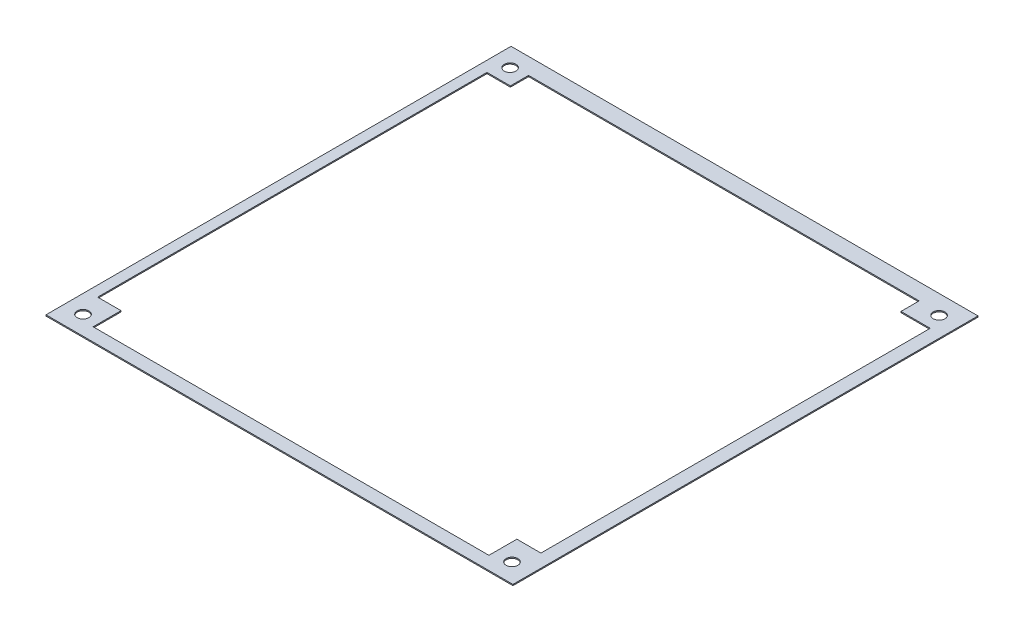
ISO-10303-21;
HEADER;
FILE_DESCRIPTION(('STEP AP214'),'2;1');
FILE_NAME('part.step','',(''),(''),'','','');
FILE_SCHEMA(('AUTOMOTIVE_DESIGN { 1 0 10303 214 1 1 1 1 }'));
ENDSEC;
DATA;
#1=APPLICATION_CONTEXT('core data for automotive mechanical design processes');
#2=APPLICATION_PROTOCOL_DEFINITION('international standard','automotive_design',2000,#1);
#3=PRODUCT_CONTEXT('',#1,'mechanical');
#4=PRODUCT('Part','Part','',(#3));
#5=PRODUCT_RELATED_PRODUCT_CATEGORY('part','',(#4));
#6=PRODUCT_DEFINITION_FORMATION('','',#4);
#7=PRODUCT_DEFINITION_CONTEXT('part definition',#1,'design');
#8=PRODUCT_DEFINITION('design','',#6,#7);
#9=PRODUCT_DEFINITION_SHAPE('','',#8);
#10=(LENGTH_UNIT() NAMED_UNIT(*) SI_UNIT(.MILLI.,.METRE.));
#11=(NAMED_UNIT(*) PLANE_ANGLE_UNIT() SI_UNIT($,.RADIAN.));
#12=(NAMED_UNIT(*) SI_UNIT($,.STERADIAN.) SOLID_ANGLE_UNIT());
#13=UNCERTAINTY_MEASURE_WITH_UNIT(LENGTH_MEASURE(1.E-05),#10,'distance_accuracy_value','');
#14=(GEOMETRIC_REPRESENTATION_CONTEXT(3) GLOBAL_UNCERTAINTY_ASSIGNED_CONTEXT((#13)) GLOBAL_UNIT_ASSIGNED_CONTEXT((#10,
#11,#12)) REPRESENTATION_CONTEXT('',''));
#15=CARTESIAN_POINT('',(0.,0.,0.));
#16=DIRECTION('',(0.,0.,1.));
#17=DIRECTION('',(1.,0.,0.));
#18=AXIS2_PLACEMENT_3D('',#15,#16,#17);
#19=CARTESIAN_POINT('',(-36.,-15.4,0.));
#20=DIRECTION('',(1.,0.,0.));
#21=DIRECTION('',(0.,0.,-1.));
#22=AXIS2_PLACEMENT_3D('',#19,#20,#21);
#23=PLANE('',#22);
#24=DIRECTION('',(0.,1.,0.));
#25=VECTOR('',#24,1.);
#26=CARTESIAN_POINT('',(-36.,-15.4,109.6));
#27=LINE('',#26,#25);
#28=CARTESIAN_POINT('',(-36.,-15.4,109.6));
#29=VERTEX_POINT('',#28);
#30=CARTESIAN_POINT('',(-36.,-14.8,109.6));
#31=VERTEX_POINT('',#30);
#32=EDGE_CURVE('E354',#29,#31,#27,.T.);
#33=ORIENTED_EDGE('',*,*,#32,.T.);
#34=DIRECTION('',(0.,0.,1.));
#35=VECTOR('',#34,1.);
#36=CARTESIAN_POINT('',(-36.,-14.8,-135.4));
#37=LINE('',#36,#35);
#38=CARTESIAN_POINT('',(-36.,-14.8,-135.4));
#39=VERTEX_POINT('',#38);
#40=EDGE_CURVE('E302',#39,#31,#37,.T.);
#41=ORIENTED_EDGE('',*,*,#40,.F.);
#42=DIRECTION('',(0.,1.,0.));
#43=VECTOR('',#42,1.);
#44=CARTESIAN_POINT('',(-36.,-15.4,-135.4));
#45=LINE('',#44,#43);
#46=CARTESIAN_POINT('',(-36.,-15.4,-135.4));
#47=VERTEX_POINT('',#46);
#48=EDGE_CURVE('E11',#47,#39,#45,.T.);
#49=ORIENTED_EDGE('',*,*,#48,.F.);
#50=DIRECTION('',(0.,0.,-1.));
#51=VECTOR('',#50,1.);
#52=CARTESIAN_POINT('',(-36.,-15.4,0.));
#53=LINE('',#52,#51);
#54=EDGE_CURVE('E339',#29,#47,#53,.T.);
#55=ORIENTED_EDGE('',*,*,#54,.F.);
#56=EDGE_LOOP('',(#33,#41,#49,#55));
#57=FACE_BOUND('',#56,.T.);
#58=ADVANCED_FACE('F47',(#57),#23,.F.);
#59=CARTESIAN_POINT('',(0.,-15.4,-135.4));
#60=DIRECTION('',(0.,0.,1.));
#61=DIRECTION('',(1.,0.,0.));
#62=AXIS2_PLACEMENT_3D('',#59,#60,#61);
#63=PLANE('',#62);
#64=ORIENTED_EDGE('',*,*,#48,.T.);
#65=DIRECTION('',(1.,0.,0.));
#66=VECTOR('',#65,1.);
#67=CARTESIAN_POINT('',(-36.,-14.8,-135.4));
#68=LINE('',#67,#66);
#69=CARTESIAN_POINT('',(210.,-14.8,-135.4));
#70=VERTEX_POINT('',#69);
#71=EDGE_CURVE('E298',#39,#70,#68,.T.);
#72=ORIENTED_EDGE('',*,*,#71,.T.);
#73=DIRECTION('',(0.,1.,0.));
#74=VECTOR('',#73,1.);
#75=CARTESIAN_POINT('',(210.,-15.4,-135.4));
#76=LINE('',#75,#74);
#77=CARTESIAN_POINT('',(210.,-15.4,-135.4));
#78=VERTEX_POINT('',#77);
#79=EDGE_CURVE('E56',#78,#70,#76,.T.);
#80=ORIENTED_EDGE('',*,*,#79,.F.);
#81=DIRECTION('',(1.,0.,0.));
#82=VECTOR('',#81,1.);
#83=CARTESIAN_POINT('',(0.,-15.4,-135.4));
#84=LINE('',#83,#82);
#85=EDGE_CURVE('E343',#47,#78,#84,.T.);
#86=ORIENTED_EDGE('',*,*,#85,.F.);
#87=EDGE_LOOP('',(#64,#72,#80,#86));
#88=FACE_BOUND('',#87,.T.);
#89=ADVANCED_FACE('F369',(#88),#63,.F.);
#90=CARTESIAN_POINT('',(210.,-15.4,0.));
#91=DIRECTION('',(1.,0.,0.));
#92=DIRECTION('',(0.,0.,-1.));
#93=AXIS2_PLACEMENT_3D('',#90,#91,#92);
#94=PLANE('',#93);
#95=DIRECTION('',(0.,0.,1.));
#96=VECTOR('',#95,1.);
#97=CARTESIAN_POINT('',(210.,-14.8,-135.4));
#98=LINE('',#97,#96);
#99=CARTESIAN_POINT('',(210.,-14.8,109.6));
#100=VERTEX_POINT('',#99);
#101=EDGE_CURVE('E305',#70,#100,#98,.T.);
#102=ORIENTED_EDGE('',*,*,#101,.T.);
#103=DIRECTION('',(0.,1.,0.));
#104=VECTOR('',#103,1.);
#105=CARTESIAN_POINT('',(210.,-15.4,109.6));
#106=LINE('',#105,#104);
#107=CARTESIAN_POINT('',(210.,-15.4,109.6));
#108=VERTEX_POINT('',#107);
#109=EDGE_CURVE('E358',#108,#100,#106,.T.);
#110=ORIENTED_EDGE('',*,*,#109,.F.);
#111=DIRECTION('',(0.,0.,-1.));
#112=VECTOR('',#111,1.);
#113=CARTESIAN_POINT('',(210.,-15.4,0.));
#114=LINE('',#113,#112);
#115=EDGE_CURVE('E346',#108,#78,#114,.T.);
#116=ORIENTED_EDGE('',*,*,#115,.T.);
#117=ORIENTED_EDGE('',*,*,#79,.T.);
#118=EDGE_LOOP('',(#102,#110,#116,#117));
#119=FACE_BOUND('',#118,.T.);
#120=ADVANCED_FACE('F366',(#119),#94,.T.);
#121=CARTESIAN_POINT('',(0.,-15.4,109.6));
#122=DIRECTION('',(0.,0.,1.));
#123=DIRECTION('',(1.,0.,0.));
#124=AXIS2_PLACEMENT_3D('',#121,#122,#123);
#125=PLANE('',#124);
#126=DIRECTION('',(1.,0.,0.));
#127=VECTOR('',#126,1.);
#128=CARTESIAN_POINT('',(-36.,-14.8,109.6));
#129=LINE('',#128,#127);
#130=EDGE_CURVE('E268',#31,#100,#129,.T.);
#131=ORIENTED_EDGE('',*,*,#130,.F.);
#132=ORIENTED_EDGE('',*,*,#32,.F.);
#133=DIRECTION('',(1.,0.,0.));
#134=VECTOR('',#133,1.);
#135=CARTESIAN_POINT('',(0.,-15.4,109.6));
#136=LINE('',#135,#134);
#137=EDGE_CURVE('E350',#29,#108,#136,.T.);
#138=ORIENTED_EDGE('',*,*,#137,.T.);
#139=ORIENTED_EDGE('',*,*,#109,.T.);
#140=EDGE_LOOP('',(#131,#132,#138,#139));
#141=FACE_BOUND('',#140,.T.);
#142=ADVANCED_FACE('F380',(#141),#125,.T.);
#143=CARTESIAN_POINT('',(0.,-15.4,0.));
#144=DIRECTION('',(0.,-1.,0.));
#145=DIRECTION('',(0.,0.,-1.));
#146=AXIS2_PLACEMENT_3D('',#143,#144,#145);
#147=PLANE('',#146);
#148=DIRECTION('',(-1.,0.,0.));
#149=VECTOR('',#148,1.);
#150=CARTESIAN_POINT('',(-18.1137276272125,-15.4,-126.744672430124));
#151=LINE('',#150,#149);
#152=CARTESIAN_POINT('',(187.662657727689,-15.4,-126.744672430124));
#153=VERTEX_POINT('',#152);
#154=CARTESIAN_POINT('',(-18.1137276272125,-15.4,-126.744672430124));
#155=VERTEX_POINT('',#154);
#156=EDGE_CURVE('E162',#153,#155,#151,.T.);
#157=ORIENTED_EDGE('',*,*,#156,.T.);
#158=DIRECTION('',(0.,0.,1.));
#159=VECTOR('',#158,1.);
#160=CARTESIAN_POINT('',(-18.1137276272125,-15.4,-117.157752646535));
#161=LINE('',#160,#159);
#162=CARTESIAN_POINT('',(-18.1137276272125,-15.4,-117.157752646535));
#163=VERTEX_POINT('',#162);
#164=EDGE_CURVE('E172',#155,#163,#161,.T.);
#165=ORIENTED_EDGE('',*,*,#164,.T.);
#166=DIRECTION('',(-1.,0.,0.));
#167=VECTOR('',#166,1.);
#168=CARTESIAN_POINT('',(-30.4397673489704,-15.4,-117.157752646535));
#169=LINE('',#168,#167);
#170=CARTESIAN_POINT('',(-30.4397673489704,-15.4,-117.157752646535));
#171=VERTEX_POINT('',#170);
#172=EDGE_CURVE('E63',#163,#171,#169,.T.);
#173=ORIENTED_EDGE('',*,*,#172,.T.);
#174=DIRECTION('',(0.,0.,1.));
#175=VECTOR('',#174,1.);
#176=CARTESIAN_POINT('',(-30.4397673489704,-15.4,87.9338527238244));
#177=LINE('',#176,#175);
#178=CARTESIAN_POINT('',(-30.4397673489704,-15.4,87.9338527238244));
#179=VERTEX_POINT('',#178);
#180=EDGE_CURVE('E190',#171,#179,#177,.T.);
#181=ORIENTED_EDGE('',*,*,#180,.T.);
#182=DIRECTION('',(1.,0.,0.));
#183=VECTOR('',#182,1.);
#184=CARTESIAN_POINT('',(-18.1137276272125,-15.4,87.9338527238244));
#185=LINE('',#184,#183);
#186=CARTESIAN_POINT('',(-18.1137276272125,-15.4,87.9338527238244));
#187=VERTEX_POINT('',#186);
#188=EDGE_CURVE('E194',#179,#187,#185,.T.);
#189=ORIENTED_EDGE('',*,*,#188,.T.);
#190=DIRECTION('',(0.,0.,1.));
#191=VECTOR('',#190,1.);
#192=CARTESIAN_POINT('',(-18.1137276272125,-15.4,102.65662239148));
#193=LINE('',#192,#191);
#194=CARTESIAN_POINT('',(-18.1137276272125,-15.4,102.65662239148));
#195=VERTEX_POINT('',#194);
#196=EDGE_CURVE('E198',#187,#195,#193,.T.);
#197=ORIENTED_EDGE('',*,*,#196,.T.);
#198=DIRECTION('',(1.,0.,0.));
#199=VECTOR('',#198,1.);
#200=CARTESIAN_POINT('',(190.401777665857,-15.4,102.65662239148));
#201=LINE('',#200,#199);
#202=CARTESIAN_POINT('',(190.401777665857,-15.4,102.65662239148));
#203=VERTEX_POINT('',#202);
#204=EDGE_CURVE('E202',#195,#203,#201,.T.);
#205=ORIENTED_EDGE('',*,*,#204,.T.);
#206=DIRECTION('',(0.,0.,-1.));
#207=VECTOR('',#206,1.);
#208=CARTESIAN_POINT('',(190.401777665857,-15.4,87.9338527238244));
#209=LINE('',#208,#207);
#210=CARTESIAN_POINT('',(190.401777665857,-15.4,87.9338527238244));
#211=VERTEX_POINT('',#210);
#212=EDGE_CURVE('E206',#203,#211,#209,.T.);
#213=ORIENTED_EDGE('',*,*,#212,.T.);
#214=DIRECTION('',(1.,0.,0.));
#215=VECTOR('',#214,1.);
#216=CARTESIAN_POINT('',(203.070207379886,-15.4,87.9338527238244));
#217=LINE('',#216,#215);
#218=CARTESIAN_POINT('',(203.070207379886,-15.4,87.9338527238244));
#219=VERTEX_POINT('',#218);
#220=EDGE_CURVE('E210',#211,#219,#217,.T.);
#221=ORIENTED_EDGE('',*,*,#220,.T.);
#222=DIRECTION('',(0.,0.,-1.));
#223=VECTOR('',#222,1.);
#224=CARTESIAN_POINT('',(203.070207379886,-15.4,-117.157752646535));
#225=LINE('',#224,#223);
#226=CARTESIAN_POINT('',(203.070207379886,-15.4,-117.157752646535));
#227=VERTEX_POINT('',#226);
#228=EDGE_CURVE('E214',#219,#227,#225,.T.);
#229=ORIENTED_EDGE('',*,*,#228,.T.);
#230=DIRECTION('',(-1.,0.,0.));
#231=VECTOR('',#230,1.);
#232=CARTESIAN_POINT('',(187.662657727689,-15.4,-117.157752646535));
#233=LINE('',#232,#231);
#234=CARTESIAN_POINT('',(187.662657727689,-15.4,-117.157752646535));
#235=VERTEX_POINT('',#234);
#236=EDGE_CURVE('E218',#227,#235,#233,.T.);
#237=ORIENTED_EDGE('',*,*,#236,.T.);
#238=DIRECTION('',(0.,0.,-1.));
#239=VECTOR('',#238,1.);
#240=CARTESIAN_POINT('',(187.662657727689,-15.4,-126.744672430124));
#241=LINE('',#240,#239);
#242=EDGE_CURVE('E169',#235,#153,#241,.T.);
#243=ORIENTED_EDGE('',*,*,#242,.T.);
#244=EDGE_LOOP('',(#157,#165,#173,#181,#189,#197,#205,#213,#221,#229,#237,#243));
#245=FACE_BOUND('',#244,.T.);
#246=CARTESIAN_POINT('',(-26.4999999999999,-15.4,99.6000000000001));
#247=DIRECTION('',(0.,1.,0.));
#248=DIRECTION('',(0.,0.,-1.));
#249=AXIS2_PLACEMENT_3D('',#246,#247,#248);
#250=CIRCLE('',#249,3.1);
#251=CARTESIAN_POINT('',(-26.4999999999999,-15.4,96.5));
#252=VERTEX_POINT('',#251);
#253=EDGE_CURVE('E323',#252,#252,#250,.T.);
#254=ORIENTED_EDGE('',*,*,#253,.T.);
#255=EDGE_LOOP('',(#254));
#256=FACE_BOUND('',#255,.T.);
#257=CARTESIAN_POINT('',(199.5,-15.4,99.6000000000001));
#258=DIRECTION('',(0.,1.,0.));
#259=DIRECTION('',(0.,0.,1.));
#260=AXIS2_PLACEMENT_3D('',#257,#258,#259);
#261=CIRCLE('',#260,3.09999999999999);
#262=CARTESIAN_POINT('',(199.5,-15.4,102.7));
#263=VERTEX_POINT('',#262);
#264=EDGE_CURVE('E329',#263,#263,#261,.T.);
#265=ORIENTED_EDGE('',*,*,#264,.T.);
#266=EDGE_LOOP('',(#265));
#267=FACE_BOUND('',#266,.T.);
#268=CARTESIAN_POINT('',(199.5,-15.4,-125.4));
#269=DIRECTION('',(0.,1.,0.));
#270=DIRECTION('',(0.,0.,1.));
#271=AXIS2_PLACEMENT_3D('',#268,#269,#270);
#272=CIRCLE('',#271,3.09999999999999);
#273=CARTESIAN_POINT('',(199.5,-15.4,-122.3));
#274=VERTEX_POINT('',#273);
#275=EDGE_CURVE('E324',#274,#274,#272,.T.);
#276=ORIENTED_EDGE('',*,*,#275,.T.);
#277=EDGE_LOOP('',(#276));
#278=FACE_BOUND('',#277,.T.);
#279=CARTESIAN_POINT('',(-26.5,-15.4,-125.4));
#280=DIRECTION('',(0.,1.,0.));
#281=DIRECTION('',(0.,0.,1.));
#282=AXIS2_PLACEMENT_3D('',#279,#280,#281);
#283=CIRCLE('',#282,3.09999999999998);
#284=CARTESIAN_POINT('',(-26.5,-15.4,-122.3));
#285=VERTEX_POINT('',#284);
#286=EDGE_CURVE('E328',#285,#285,#283,.T.);
#287=ORIENTED_EDGE('',*,*,#286,.T.);
#288=EDGE_LOOP('',(#287));
#289=FACE_BOUND('',#288,.T.);
#290=ORIENTED_EDGE('',*,*,#54,.T.);
#291=ORIENTED_EDGE('',*,*,#85,.T.);
#292=ORIENTED_EDGE('',*,*,#115,.F.);
#293=ORIENTED_EDGE('',*,*,#137,.F.);
#294=EDGE_LOOP('',(#290,#291,#292,#293));
#295=FACE_BOUND('',#294,.T.);
#296=ADVANCED_FACE('F178',(#245,#256,#267,#278,#289,#295),#147,.T.);
#297=CARTESIAN_POINT('',(-26.5,-15.4,-125.4));
#298=DIRECTION('',(0.,1.,0.));
#299=DIRECTION('',(0.,0.,1.));
#300=AXIS2_PLACEMENT_3D('',#297,#298,#299);
#301=CYLINDRICAL_SURFACE('',#300,3.09999999999998);
#302=CARTESIAN_POINT('',(-26.5,-14.8,-125.4));
#303=DIRECTION('',(0.,-1.,0.));
#304=DIRECTION('',(0.,0.,-1.));
#305=AXIS2_PLACEMENT_3D('',#302,#303,#304);
#306=CIRCLE('',#305,3.09999999999998);
#307=CARTESIAN_POINT('',(-26.5,-14.8,-128.5));
#308=VERTEX_POINT('',#307);
#309=EDGE_CURVE('E319',#308,#308,#306,.F.);
#310=ORIENTED_EDGE('',*,*,#309,.T.);
#311=EDGE_LOOP('',(#310));
#312=FACE_BOUND('',#311,.T.);
#313=ORIENTED_EDGE('',*,*,#286,.F.);
#314=EDGE_LOOP('',(#313));
#315=FACE_BOUND('',#314,.T.);
#316=ADVANCED_FACE('F383',(#312,#315),#301,.F.);
#317=CARTESIAN_POINT('',(199.5,-15.4,-125.4));
#318=DIRECTION('',(0.,1.,0.));
#319=DIRECTION('',(0.,0.,1.));
#320=AXIS2_PLACEMENT_3D('',#317,#318,#319);
#321=CYLINDRICAL_SURFACE('',#320,3.09999999999999);
#322=CARTESIAN_POINT('',(199.5,-14.8,-125.4));
#323=DIRECTION('',(0.,-1.,0.));
#324=DIRECTION('',(0.,0.,-1.));
#325=AXIS2_PLACEMENT_3D('',#322,#323,#324);
#326=CIRCLE('',#325,3.09999999999999);
#327=CARTESIAN_POINT('',(199.5,-14.8,-128.5));
#328=VERTEX_POINT('',#327);
#329=EDGE_CURVE('E315',#328,#328,#326,.F.);
#330=ORIENTED_EDGE('',*,*,#329,.T.);
#331=EDGE_LOOP('',(#330));
#332=FACE_BOUND('',#331,.T.);
#333=ORIENTED_EDGE('',*,*,#275,.F.);
#334=EDGE_LOOP('',(#333));
#335=FACE_BOUND('',#334,.T.);
#336=ADVANCED_FACE('F390',(#332,#335),#321,.F.);
#337=CARTESIAN_POINT('',(199.5,-15.4,99.6000000000001));
#338=DIRECTION('',(0.,1.,0.));
#339=DIRECTION('',(0.,0.,1.));
#340=AXIS2_PLACEMENT_3D('',#337,#338,#339);
#341=CYLINDRICAL_SURFACE('',#340,3.09999999999999);
#342=CARTESIAN_POINT('',(199.5,-14.8,99.6000000000001));
#343=DIRECTION('',(0.,-1.,0.));
#344=DIRECTION('',(0.,0.,-1.));
#345=AXIS2_PLACEMENT_3D('',#342,#343,#344);
#346=CIRCLE('',#345,3.09999999999999);
#347=CARTESIAN_POINT('',(199.5,-14.8,96.5000000000001));
#348=VERTEX_POINT('',#347);
#349=EDGE_CURVE('E311',#348,#348,#346,.F.);
#350=ORIENTED_EDGE('',*,*,#349,.T.);
#351=EDGE_LOOP('',(#350));
#352=FACE_BOUND('',#351,.T.);
#353=ORIENTED_EDGE('',*,*,#264,.F.);
#354=EDGE_LOOP('',(#353));
#355=FACE_BOUND('',#354,.T.);
#356=ADVANCED_FACE('F423',(#352,#355),#341,.F.);
#357=CARTESIAN_POINT('',(-26.4999999999999,-15.4,99.6000000000001));
#358=DIRECTION('',(0.,1.,0.));
#359=DIRECTION('',(0.,0.,1.));
#360=AXIS2_PLACEMENT_3D('',#357,#358,#359);
#361=CYLINDRICAL_SURFACE('',#360,3.1);
#362=CARTESIAN_POINT('',(-26.4999999999999,-14.8,99.6000000000001));
#363=DIRECTION('',(0.,-1.,0.));
#364=DIRECTION('',(0.,0.,-1.));
#365=AXIS2_PLACEMENT_3D('',#362,#363,#364);
#366=CIRCLE('',#365,3.1);
#367=CARTESIAN_POINT('',(-26.4999999999999,-14.8,96.5));
#368=VERTEX_POINT('',#367);
#369=EDGE_CURVE('E50',#368,#368,#366,.F.);
#370=ORIENTED_EDGE('',*,*,#369,.T.);
#371=EDGE_LOOP('',(#370));
#372=FACE_BOUND('',#371,.T.);
#373=ORIENTED_EDGE('',*,*,#253,.F.);
#374=EDGE_LOOP('',(#373));
#375=FACE_BOUND('',#374,.T.);
#376=ADVANCED_FACE('F431',(#372,#375),#361,.F.);
#377=CARTESIAN_POINT('',(-36.,-14.8,-135.4));
#378=DIRECTION('',(0.,-1.,0.));
#379=DIRECTION('',(0.,0.,-1.));
#380=AXIS2_PLACEMENT_3D('',#377,#378,#379);
#381=PLANE('',#380);
#382=DIRECTION('',(0.,0.,1.));
#383=VECTOR('',#382,1.);
#384=CARTESIAN_POINT('',(-18.1137276272125,-14.8,-117.157752646535));
#385=LINE('',#384,#383);
#386=CARTESIAN_POINT('',(-18.1137276272125,-14.8,-126.744672430124));
#387=VERTEX_POINT('',#386);
#388=CARTESIAN_POINT('',(-18.1137276272125,-14.8,-117.157752646535));
#389=VERTEX_POINT('',#388);
#390=EDGE_CURVE('E223',#387,#389,#385,.T.);
#391=ORIENTED_EDGE('',*,*,#390,.F.);
#392=DIRECTION('',(-1.,0.,0.));
#393=VECTOR('',#392,1.);
#394=CARTESIAN_POINT('',(-13.3202677354178,-14.8,-126.744672430124));
#395=LINE('',#394,#393);
#396=CARTESIAN_POINT('',(187.662657727689,-14.8,-126.744672430124));
#397=VERTEX_POINT('',#396);
#398=EDGE_CURVE('E165',#397,#387,#395,.T.);
#399=ORIENTED_EDGE('',*,*,#398,.F.);
#400=DIRECTION('',(0.,0.,-1.));
#401=VECTOR('',#400,1.);
#402=CARTESIAN_POINT('',(187.662657727689,-14.8,-126.744672430124));
#403=LINE('',#402,#401);
#404=CARTESIAN_POINT('',(187.662657727689,-14.8,-117.157752646535));
#405=VERTEX_POINT('',#404);
#406=EDGE_CURVE('E185',#405,#397,#403,.T.);
#407=ORIENTED_EDGE('',*,*,#406,.F.);
#408=DIRECTION('',(-1.,0.,0.));
#409=VECTOR('',#408,1.);
#410=CARTESIAN_POINT('',(187.662657727689,-14.8,-117.157752646535));
#411=LINE('',#410,#409);
#412=CARTESIAN_POINT('',(203.070207379886,-14.8,-117.157752646535));
#413=VERTEX_POINT('',#412);
#414=EDGE_CURVE('E258',#413,#405,#411,.T.);
#415=ORIENTED_EDGE('',*,*,#414,.F.);
#416=DIRECTION('',(0.,0.,-1.));
#417=VECTOR('',#416,1.);
#418=CARTESIAN_POINT('',(203.070207379886,-14.8,-117.157752646535));
#419=LINE('',#418,#417);
#420=CARTESIAN_POINT('',(203.070207379886,-14.8,87.9338527238244));
#421=VERTEX_POINT('',#420);
#422=EDGE_CURVE('E254',#421,#413,#419,.T.);
#423=ORIENTED_EDGE('',*,*,#422,.F.);
#424=DIRECTION('',(1.,0.,0.));
#425=VECTOR('',#424,1.);
#426=CARTESIAN_POINT('',(203.070207379886,-14.8,87.9338527238244));
#427=LINE('',#426,#425);
#428=CARTESIAN_POINT('',(190.401777665857,-14.8,87.9338527238244));
#429=VERTEX_POINT('',#428);
#430=EDGE_CURVE('E250',#429,#421,#427,.T.);
#431=ORIENTED_EDGE('',*,*,#430,.F.);
#432=DIRECTION('',(0.,0.,-1.));
#433=VECTOR('',#432,1.);
#434=CARTESIAN_POINT('',(190.401777665857,-14.8,87.9338527238244));
#435=LINE('',#434,#433);
#436=CARTESIAN_POINT('',(190.401777665857,-14.8,102.65662239148));
#437=VERTEX_POINT('',#436);
#438=EDGE_CURVE('E246',#437,#429,#435,.T.);
#439=ORIENTED_EDGE('',*,*,#438,.F.);
#440=DIRECTION('',(1.,0.,0.));
#441=VECTOR('',#440,1.);
#442=CARTESIAN_POINT('',(190.401777665857,-14.8,102.65662239148));
#443=LINE('',#442,#441);
#444=CARTESIAN_POINT('',(-18.1137276272125,-14.8,102.65662239148));
#445=VERTEX_POINT('',#444);
#446=EDGE_CURVE('E242',#445,#437,#443,.T.);
#447=ORIENTED_EDGE('',*,*,#446,.F.);
#448=DIRECTION('',(0.,0.,1.));
#449=VECTOR('',#448,1.);
#450=CARTESIAN_POINT('',(-18.1137276272125,-14.8,102.65662239148));
#451=LINE('',#450,#449);
#452=CARTESIAN_POINT('',(-18.1137276272125,-14.8,87.9338527238244));
#453=VERTEX_POINT('',#452);
#454=EDGE_CURVE('E238',#453,#445,#451,.T.);
#455=ORIENTED_EDGE('',*,*,#454,.F.);
#456=DIRECTION('',(1.,0.,0.));
#457=VECTOR('',#456,1.);
#458=CARTESIAN_POINT('',(-18.1137276272125,-14.8,87.9338527238244));
#459=LINE('',#458,#457);
#460=CARTESIAN_POINT('',(-30.4397673489704,-14.8,87.9338527238244));
#461=VERTEX_POINT('',#460);
#462=EDGE_CURVE('E234',#461,#453,#459,.T.);
#463=ORIENTED_EDGE('',*,*,#462,.F.);
#464=DIRECTION('',(0.,0.,1.));
#465=VECTOR('',#464,1.);
#466=CARTESIAN_POINT('',(-30.4397673489704,-14.8,87.9338527238244));
#467=LINE('',#466,#465);
#468=CARTESIAN_POINT('',(-30.4397673489704,-14.8,-117.157752646535));
#469=VERTEX_POINT('',#468);
#470=EDGE_CURVE('E230',#469,#461,#467,.T.);
#471=ORIENTED_EDGE('',*,*,#470,.F.);
#472=DIRECTION('',(-1.,0.,0.));
#473=VECTOR('',#472,1.);
#474=CARTESIAN_POINT('',(-30.4397673489704,-14.8,-117.157752646535));
#475=LINE('',#474,#473);
#476=EDGE_CURVE('E226',#389,#469,#475,.T.);
#477=ORIENTED_EDGE('',*,*,#476,.F.);
#478=EDGE_LOOP('',(#391,#399,#407,#415,#423,#431,#439,#447,#455,#463,#471,#477));
#479=FACE_BOUND('',#478,.T.);
#480=ORIENTED_EDGE('',*,*,#329,.F.);
#481=EDGE_LOOP('',(#480));
#482=FACE_BOUND('',#481,.T.);
#483=ORIENTED_EDGE('',*,*,#369,.F.);
#484=EDGE_LOOP('',(#483));
#485=FACE_BOUND('',#484,.T.);
#486=ORIENTED_EDGE('',*,*,#130,.T.);
#487=ORIENTED_EDGE('',*,*,#101,.F.);
#488=ORIENTED_EDGE('',*,*,#71,.F.);
#489=ORIENTED_EDGE('',*,*,#40,.T.);
#490=EDGE_LOOP('',(#486,#487,#488,#489));
#491=FACE_BOUND('',#490,.T.);
#492=ORIENTED_EDGE('',*,*,#349,.F.);
#493=EDGE_LOOP('',(#492));
#494=FACE_BOUND('',#493,.T.);
#495=ORIENTED_EDGE('',*,*,#309,.F.);
#496=EDGE_LOOP('',(#495));
#497=FACE_BOUND('',#496,.T.);
#498=ADVANCED_FACE('F373',(#479,#482,#485,#491,#494,#497),#381,.F.);
#499=CARTESIAN_POINT('',(-13.3202677354178,-15.4,-126.744672430124));
#500=DIRECTION('',(0.,0.,-1.));
#501=DIRECTION('',(-1.,0.,0.));
#502=AXIS2_PLACEMENT_3D('',#499,#500,#501);
#503=PLANE('',#502);
#504=ORIENTED_EDGE('',*,*,#398,.T.);
#505=DIRECTION('',(0.,1.,0.));
#506=VECTOR('',#505,1.);
#507=CARTESIAN_POINT('',(-18.1137276272125,-15.4,-126.744672430124));
#508=LINE('',#507,#506);
#509=EDGE_CURVE('E71',#155,#387,#508,.T.);
#510=ORIENTED_EDGE('',*,*,#509,.F.);
#511=ORIENTED_EDGE('',*,*,#156,.F.);
#512=DIRECTION('',(0.,1.,0.));
#513=VECTOR('',#512,1.);
#514=CARTESIAN_POINT('',(187.662657727689,-15.4,-126.744672430124));
#515=LINE('',#514,#513);
#516=EDGE_CURVE('E265',#153,#397,#515,.T.);
#517=ORIENTED_EDGE('',*,*,#516,.T.);
#518=EDGE_LOOP('',(#504,#510,#511,#517));
#519=FACE_BOUND('',#518,.T.);
#520=ADVANCED_FACE('F160',(#519),#503,.F.);
#521=CARTESIAN_POINT('',(187.662657727689,-15.4,-126.744672430124));
#522=DIRECTION('',(1.,0.,0.));
#523=DIRECTION('',(0.,0.,-1.));
#524=AXIS2_PLACEMENT_3D('',#521,#522,#523);
#525=PLANE('',#524);
#526=ORIENTED_EDGE('',*,*,#406,.T.);
#527=ORIENTED_EDGE('',*,*,#516,.F.);
#528=ORIENTED_EDGE('',*,*,#242,.F.);
#529=DIRECTION('',(0.,1.,0.));
#530=VECTOR('',#529,1.);
#531=CARTESIAN_POINT('',(187.662657727689,-15.4,-117.157752646535));
#532=LINE('',#531,#530);
#533=EDGE_CURVE('E269',#235,#405,#532,.T.);
#534=ORIENTED_EDGE('',*,*,#533,.T.);
#535=EDGE_LOOP('',(#526,#527,#528,#534));
#536=FACE_BOUND('',#535,.T.);
#537=ADVANCED_FACE('F479',(#536),#525,.F.);
#538=CARTESIAN_POINT('',(187.662657727689,-15.4,-117.157752646535));
#539=DIRECTION('',(0.,0.,-1.));
#540=DIRECTION('',(-1.,0.,0.));
#541=AXIS2_PLACEMENT_3D('',#538,#539,#540);
#542=PLANE('',#541);
#543=ORIENTED_EDGE('',*,*,#414,.T.);
#544=ORIENTED_EDGE('',*,*,#533,.F.);
#545=ORIENTED_EDGE('',*,*,#236,.F.);
#546=DIRECTION('',(0.,1.,0.));
#547=VECTOR('',#546,1.);
#548=CARTESIAN_POINT('',(203.070207379886,-15.4,-117.157752646535));
#549=LINE('',#548,#547);
#550=EDGE_CURVE('E272',#227,#413,#549,.T.);
#551=ORIENTED_EDGE('',*,*,#550,.T.);
#552=EDGE_LOOP('',(#543,#544,#545,#551));
#553=FACE_BOUND('',#552,.T.);
#554=ADVANCED_FACE('F488',(#553),#542,.F.);
#555=CARTESIAN_POINT('',(203.070207379886,-15.4,-117.157752646535));
#556=DIRECTION('',(1.,0.,0.));
#557=DIRECTION('',(0.,0.,-1.));
#558=AXIS2_PLACEMENT_3D('',#555,#556,#557);
#559=PLANE('',#558);
#560=ORIENTED_EDGE('',*,*,#422,.T.);
#561=ORIENTED_EDGE('',*,*,#550,.F.);
#562=ORIENTED_EDGE('',*,*,#228,.F.);
#563=DIRECTION('',(0.,1.,0.));
#564=VECTOR('',#563,1.);
#565=CARTESIAN_POINT('',(203.070207379886,-15.4,87.9338527238244));
#566=LINE('',#565,#564);
#567=EDGE_CURVE('E275',#219,#421,#566,.T.);
#568=ORIENTED_EDGE('',*,*,#567,.T.);
#569=EDGE_LOOP('',(#560,#561,#562,#568));
#570=FACE_BOUND('',#569,.T.);
#571=ADVANCED_FACE('F497',(#570),#559,.F.);
#572=CARTESIAN_POINT('',(203.070207379886,-15.4,87.9338527238244));
#573=DIRECTION('',(0.,0.,1.));
#574=DIRECTION('',(1.,0.,0.));
#575=AXIS2_PLACEMENT_3D('',#572,#573,#574);
#576=PLANE('',#575);
#577=ORIENTED_EDGE('',*,*,#430,.T.);
#578=ORIENTED_EDGE('',*,*,#567,.F.);
#579=ORIENTED_EDGE('',*,*,#220,.F.);
#580=DIRECTION('',(0.,1.,0.));
#581=VECTOR('',#580,1.);
#582=CARTESIAN_POINT('',(190.401777665857,-15.4,87.9338527238244));
#583=LINE('',#582,#581);
#584=EDGE_CURVE('E278',#211,#429,#583,.T.);
#585=ORIENTED_EDGE('',*,*,#584,.T.);
#586=EDGE_LOOP('',(#577,#578,#579,#585));
#587=FACE_BOUND('',#586,.T.);
#588=ADVANCED_FACE('F506',(#587),#576,.F.);
#589=CARTESIAN_POINT('',(190.401777665857,-15.4,87.9338527238244));
#590=DIRECTION('',(1.,0.,0.));
#591=DIRECTION('',(0.,0.,-1.));
#592=AXIS2_PLACEMENT_3D('',#589,#590,#591);
#593=PLANE('',#592);
#594=ORIENTED_EDGE('',*,*,#438,.T.);
#595=ORIENTED_EDGE('',*,*,#584,.F.);
#596=ORIENTED_EDGE('',*,*,#212,.F.);
#597=DIRECTION('',(0.,1.,0.));
#598=VECTOR('',#597,1.);
#599=CARTESIAN_POINT('',(190.401777665857,-15.4,102.65662239148));
#600=LINE('',#599,#598);
#601=EDGE_CURVE('E281',#203,#437,#600,.T.);
#602=ORIENTED_EDGE('',*,*,#601,.T.);
#603=EDGE_LOOP('',(#594,#595,#596,#602));
#604=FACE_BOUND('',#603,.T.);
#605=ADVANCED_FACE('F515',(#604),#593,.F.);
#606=CARTESIAN_POINT('',(190.401777665857,-15.4,102.65662239148));
#607=DIRECTION('',(0.,0.,1.));
#608=DIRECTION('',(1.,0.,0.));
#609=AXIS2_PLACEMENT_3D('',#606,#607,#608);
#610=PLANE('',#609);
#611=ORIENTED_EDGE('',*,*,#446,.T.);
#612=ORIENTED_EDGE('',*,*,#601,.F.);
#613=ORIENTED_EDGE('',*,*,#204,.F.);
#614=DIRECTION('',(0.,1.,0.));
#615=VECTOR('',#614,1.);
#616=CARTESIAN_POINT('',(-18.1137276272125,-15.4,102.65662239148));
#617=LINE('',#616,#615);
#618=EDGE_CURVE('E284',#195,#445,#617,.T.);
#619=ORIENTED_EDGE('',*,*,#618,.T.);
#620=EDGE_LOOP('',(#611,#612,#613,#619));
#621=FACE_BOUND('',#620,.T.);
#622=ADVANCED_FACE('F524',(#621),#610,.F.);
#623=CARTESIAN_POINT('',(-18.1137276272125,-15.4,102.65662239148));
#624=DIRECTION('',(-1.,0.,0.));
#625=DIRECTION('',(0.,0.,1.));
#626=AXIS2_PLACEMENT_3D('',#623,#624,#625);
#627=PLANE('',#626);
#628=ORIENTED_EDGE('',*,*,#454,.T.);
#629=ORIENTED_EDGE('',*,*,#618,.F.);
#630=ORIENTED_EDGE('',*,*,#196,.F.);
#631=DIRECTION('',(0.,1.,0.));
#632=VECTOR('',#631,1.);
#633=CARTESIAN_POINT('',(-18.1137276272125,-15.4,87.9338527238244));
#634=LINE('',#633,#632);
#635=EDGE_CURVE('E287',#187,#453,#634,.T.);
#636=ORIENTED_EDGE('',*,*,#635,.T.);
#637=EDGE_LOOP('',(#628,#629,#630,#636));
#638=FACE_BOUND('',#637,.T.);
#639=ADVANCED_FACE('F533',(#638),#627,.F.);
#640=CARTESIAN_POINT('',(-18.1137276272125,-15.4,87.9338527238244));
#641=DIRECTION('',(0.,0.,1.));
#642=DIRECTION('',(1.,0.,0.));
#643=AXIS2_PLACEMENT_3D('',#640,#641,#642);
#644=PLANE('',#643);
#645=ORIENTED_EDGE('',*,*,#462,.T.);
#646=ORIENTED_EDGE('',*,*,#635,.F.);
#647=ORIENTED_EDGE('',*,*,#188,.F.);
#648=DIRECTION('',(0.,1.,0.));
#649=VECTOR('',#648,1.);
#650=CARTESIAN_POINT('',(-30.4397673489704,-15.4,87.9338527238244));
#651=LINE('',#650,#649);
#652=EDGE_CURVE('E290',#179,#461,#651,.T.);
#653=ORIENTED_EDGE('',*,*,#652,.T.);
#654=EDGE_LOOP('',(#645,#646,#647,#653));
#655=FACE_BOUND('',#654,.T.);
#656=ADVANCED_FACE('F542',(#655),#644,.F.);
#657=CARTESIAN_POINT('',(-30.4397673489704,-15.4,87.9338527238244));
#658=DIRECTION('',(-1.,0.,0.));
#659=DIRECTION('',(0.,0.,1.));
#660=AXIS2_PLACEMENT_3D('',#657,#658,#659);
#661=PLANE('',#660);
#662=ORIENTED_EDGE('',*,*,#470,.T.);
#663=ORIENTED_EDGE('',*,*,#652,.F.);
#664=ORIENTED_EDGE('',*,*,#180,.F.);
#665=DIRECTION('',(0.,1.,0.));
#666=VECTOR('',#665,1.);
#667=CARTESIAN_POINT('',(-30.4397673489704,-15.4,-117.157752646535));
#668=LINE('',#667,#666);
#669=EDGE_CURVE('E293',#171,#469,#668,.T.);
#670=ORIENTED_EDGE('',*,*,#669,.T.);
#671=EDGE_LOOP('',(#662,#663,#664,#670));
#672=FACE_BOUND('',#671,.T.);
#673=ADVANCED_FACE('F551',(#672),#661,.F.);
#674=CARTESIAN_POINT('',(-30.4397673489704,-15.4,-117.157752646535));
#675=DIRECTION('',(0.,0.,-1.));
#676=DIRECTION('',(-1.,0.,0.));
#677=AXIS2_PLACEMENT_3D('',#674,#675,#676);
#678=PLANE('',#677);
#679=ORIENTED_EDGE('',*,*,#476,.T.);
#680=ORIENTED_EDGE('',*,*,#669,.F.);
#681=ORIENTED_EDGE('',*,*,#172,.F.);
#682=DIRECTION('',(0.,1.,0.));
#683=VECTOR('',#682,1.);
#684=CARTESIAN_POINT('',(-18.1137276272125,-15.4,-117.157752646535));
#685=LINE('',#684,#683);
#686=EDGE_CURVE('E168',#163,#389,#685,.T.);
#687=ORIENTED_EDGE('',*,*,#686,.T.);
#688=EDGE_LOOP('',(#679,#680,#681,#687));
#689=FACE_BOUND('',#688,.T.);
#690=ADVANCED_FACE('F560',(#689),#678,.F.);
#691=CARTESIAN_POINT('',(-18.1137276272125,-15.4,-117.157752646535));
#692=DIRECTION('',(-1.,0.,0.));
#693=DIRECTION('',(0.,0.,1.));
#694=AXIS2_PLACEMENT_3D('',#691,#692,#693);
#695=PLANE('',#694);
#696=ORIENTED_EDGE('',*,*,#390,.T.);
#697=ORIENTED_EDGE('',*,*,#686,.F.);
#698=ORIENTED_EDGE('',*,*,#164,.F.);
#699=ORIENTED_EDGE('',*,*,#509,.T.);
#700=EDGE_LOOP('',(#696,#697,#698,#699));
#701=FACE_BOUND('',#700,.T.);
#702=ADVANCED_FACE('F173',(#701),#695,.F.);
#703=CLOSED_SHELL('',(#58,#89,#120,#142,#296,#316,#336,#356,#376,#498,#520,#537,#554,#571,#588,
#605,#622,#639,#656,#673,#690,#702));
#704=MANIFOLD_SOLID_BREP('B2',#703);
#705=ADVANCED_BREP_SHAPE_REPRESENTATION('',(#18,#704),#14);
#706=SHAPE_DEFINITION_REPRESENTATION(#9,#705);
ENDSEC;
END-ISO-10303-21;
